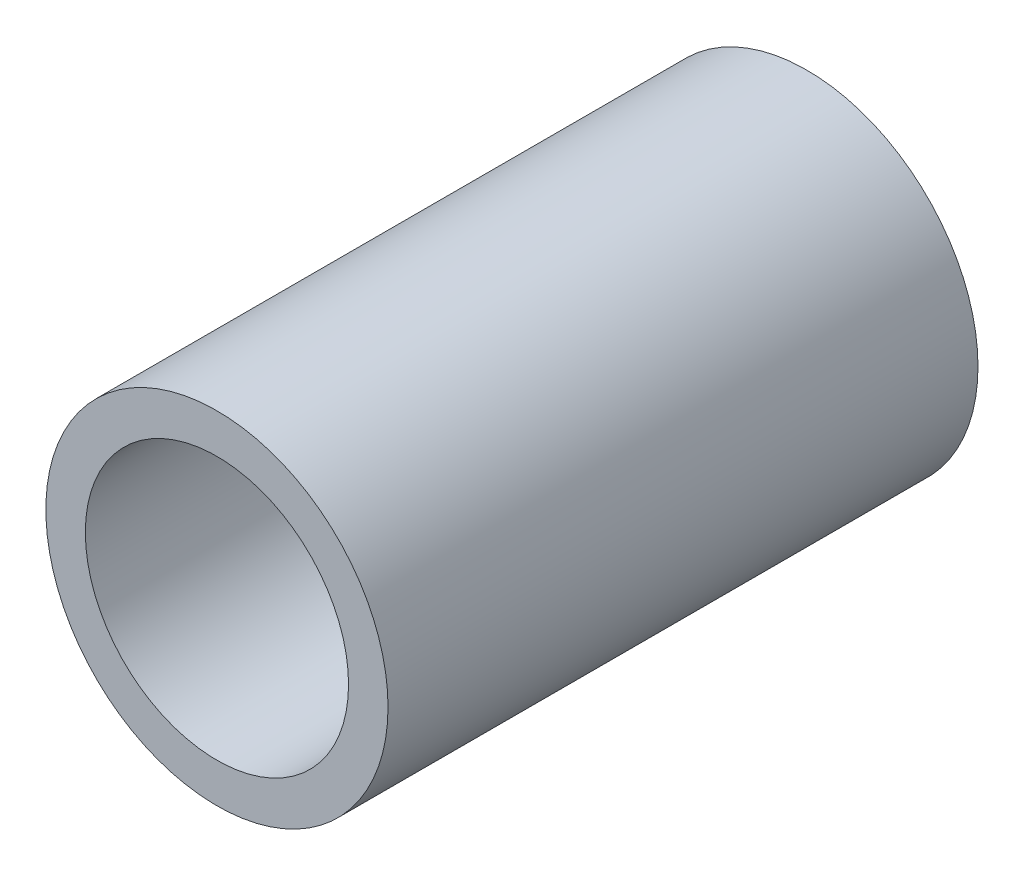
ISO-10303-21;
HEADER;
FILE_DESCRIPTION(('STEP AP214'),'2;1');
FILE_NAME('part.step','',(''),(''),'','','');
FILE_SCHEMA(('AUTOMOTIVE_DESIGN { 1 0 10303 214 1 1 1 1 }'));
ENDSEC;
DATA;
#1=APPLICATION_CONTEXT('core data for automotive mechanical design processes');
#2=APPLICATION_PROTOCOL_DEFINITION('international standard','automotive_design',2000,#1);
#3=PRODUCT_CONTEXT('',#1,'mechanical');
#4=PRODUCT('Part','Part','',(#3));
#5=PRODUCT_RELATED_PRODUCT_CATEGORY('part','',(#4));
#6=PRODUCT_DEFINITION_FORMATION('','',#4);
#7=PRODUCT_DEFINITION_CONTEXT('part definition',#1,'design');
#8=PRODUCT_DEFINITION('design','',#6,#7);
#9=PRODUCT_DEFINITION_SHAPE('','',#8);
#10=(LENGTH_UNIT() NAMED_UNIT(*) SI_UNIT(.MILLI.,.METRE.));
#11=(NAMED_UNIT(*) PLANE_ANGLE_UNIT() SI_UNIT($,.RADIAN.));
#12=(NAMED_UNIT(*) SI_UNIT($,.STERADIAN.) SOLID_ANGLE_UNIT());
#13=UNCERTAINTY_MEASURE_WITH_UNIT(LENGTH_MEASURE(1.E-05),#10,'distance_accuracy_value','');
#14=(GEOMETRIC_REPRESENTATION_CONTEXT(3) GLOBAL_UNCERTAINTY_ASSIGNED_CONTEXT((#13)) GLOBAL_UNIT_ASSIGNED_CONTEXT((#10,
#11,#12)) REPRESENTATION_CONTEXT('',''));
#15=CARTESIAN_POINT('',(0.,0.,0.));
#16=DIRECTION('',(0.,0.,1.));
#17=DIRECTION('',(1.,0.,0.));
#18=AXIS2_PLACEMENT_3D('',#15,#16,#17);
#19=CARTESIAN_POINT('',(0.,0.,11.207));
#20=DIRECTION('',(0.,0.,1.));
#21=DIRECTION('',(1.,0.,0.));
#22=AXIS2_PLACEMENT_3D('',#19,#20,#21);
#23=PLANE('',#22);
#24=CARTESIAN_POINT('',(0.,0.,11.207));
#25=DIRECTION('',(0.,0.,1.));
#26=DIRECTION('',(1.,0.,0.));
#27=AXIS2_PLACEMENT_3D('',#24,#25,#26);
#28=CIRCLE('',#27,3.25);
#29=CARTESIAN_POINT('',(3.25,0.,11.207));
#30=VERTEX_POINT('',#29);
#31=EDGE_CURVE('E10',#30,#30,#28,.T.);
#32=ORIENTED_EDGE('',*,*,#31,.T.);
#33=EDGE_LOOP('',(#32));
#34=FACE_BOUND('',#33,.T.);
#35=CARTESIAN_POINT('',(0.,0.,11.207));
#36=DIRECTION('',(0.,0.,1.));
#37=DIRECTION('',(1.,0.,0.));
#38=AXIS2_PLACEMENT_3D('',#35,#36,#37);
#39=CIRCLE('',#38,2.5);
#40=CARTESIAN_POINT('',(2.5,0.,11.207));
#41=VERTEX_POINT('',#40);
#42=EDGE_CURVE('E41',#41,#41,#39,.T.);
#43=ORIENTED_EDGE('',*,*,#42,.F.);
#44=EDGE_LOOP('',(#43));
#45=FACE_BOUND('',#44,.T.);
#46=ADVANCED_FACE('F30',(#34,#45),#23,.T.);
#47=CARTESIAN_POINT('',(0.,0.,0.));
#48=DIRECTION('',(0.,0.,1.));
#49=DIRECTION('',(1.,0.,0.));
#50=AXIS2_PLACEMENT_3D('',#47,#48,#49);
#51=PLANE('',#50);
#52=CARTESIAN_POINT('',(0.,0.,0.));
#53=DIRECTION('',(0.,0.,1.));
#54=DIRECTION('',(1.,0.,0.));
#55=AXIS2_PLACEMENT_3D('',#52,#53,#54);
#56=CIRCLE('',#55,3.25);
#57=CARTESIAN_POINT('',(3.25,0.,0.));
#58=VERTEX_POINT('',#57);
#59=EDGE_CURVE('E34',#58,#58,#56,.T.);
#60=ORIENTED_EDGE('',*,*,#59,.F.);
#61=EDGE_LOOP('',(#60));
#62=FACE_BOUND('',#61,.T.);
#63=CARTESIAN_POINT('',(0.,0.,0.));
#64=DIRECTION('',(0.,0.,1.));
#65=DIRECTION('',(1.,0.,0.));
#66=AXIS2_PLACEMENT_3D('',#63,#64,#65);
#67=CIRCLE('',#66,2.5);
#68=CARTESIAN_POINT('',(2.5,0.,0.));
#69=VERTEX_POINT('',#68);
#70=EDGE_CURVE('E43',#69,#69,#67,.T.);
#71=ORIENTED_EDGE('',*,*,#70,.T.);
#72=EDGE_LOOP('',(#71));
#73=FACE_BOUND('',#72,.T.);
#74=ADVANCED_FACE('F53',(#62,#73),#51,.F.);
#75=CARTESIAN_POINT('',(0.,0.,11.207));
#76=DIRECTION('',(0.,0.,-1.));
#77=DIRECTION('',(-1.,0.,0.));
#78=AXIS2_PLACEMENT_3D('',#75,#76,#77);
#79=CYLINDRICAL_SURFACE('',#78,3.25);
#80=ORIENTED_EDGE('',*,*,#31,.F.);
#81=EDGE_LOOP('',(#80));
#82=FACE_BOUND('',#81,.T.);
#83=ORIENTED_EDGE('',*,*,#59,.T.);
#84=EDGE_LOOP('',(#83));
#85=FACE_BOUND('',#84,.T.);
#86=ADVANCED_FACE('F32',(#82,#85),#79,.T.);
#87=CARTESIAN_POINT('',(0.,0.,11.207));
#88=DIRECTION('',(0.,0.,-1.));
#89=DIRECTION('',(-1.,0.,0.));
#90=AXIS2_PLACEMENT_3D('',#87,#88,#89);
#91=CYLINDRICAL_SURFACE('',#90,2.5);
#92=ORIENTED_EDGE('',*,*,#42,.T.);
#93=EDGE_LOOP('',(#92));
#94=FACE_BOUND('',#93,.T.);
#95=ORIENTED_EDGE('',*,*,#70,.F.);
#96=EDGE_LOOP('',(#95));
#97=FACE_BOUND('',#96,.T.);
#98=ADVANCED_FACE('F49',(#94,#97),#91,.F.);
#99=CLOSED_SHELL('',(#46,#74,#86,#98));
#100=MANIFOLD_SOLID_BREP('B2',#99);
#101=ADVANCED_BREP_SHAPE_REPRESENTATION('',(#18,#100),#14);
#102=SHAPE_DEFINITION_REPRESENTATION(#9,#101);
ENDSEC;
END-ISO-10303-21;
